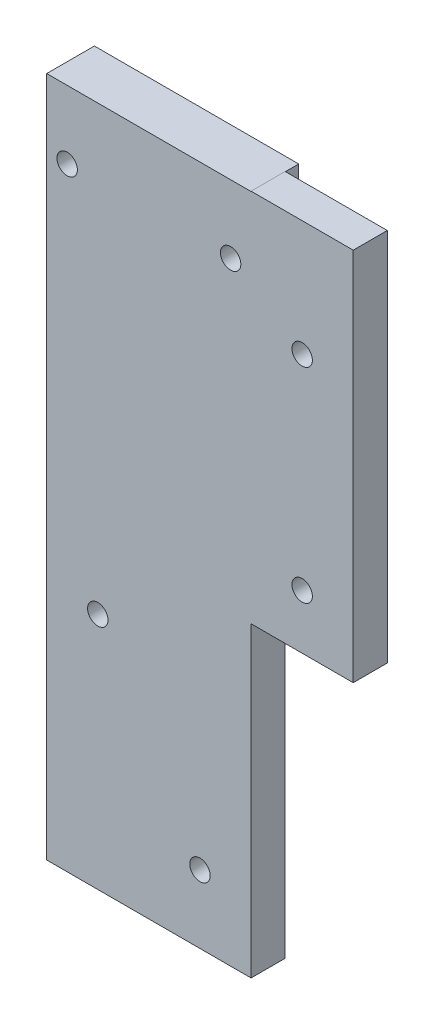
ISO-10303-21;
HEADER;
FILE_DESCRIPTION(('STEP AP214'),'2;1');
FILE_NAME('part.step','',(''),(''),'','','');
FILE_SCHEMA(('AUTOMOTIVE_DESIGN { 1 0 10303 214 1 1 1 1 }'));
ENDSEC;
DATA;
#1=APPLICATION_CONTEXT('core data for automotive mechanical design processes');
#2=APPLICATION_PROTOCOL_DEFINITION('international standard','automotive_design',2000,#1);
#3=PRODUCT_CONTEXT('',#1,'mechanical');
#4=PRODUCT('Part','Part','',(#3));
#5=PRODUCT_RELATED_PRODUCT_CATEGORY('part','',(#4));
#6=PRODUCT_DEFINITION_FORMATION('','',#4);
#7=PRODUCT_DEFINITION_CONTEXT('part definition',#1,'design');
#8=PRODUCT_DEFINITION('design','',#6,#7);
#9=PRODUCT_DEFINITION_SHAPE('','',#8);
#10=(LENGTH_UNIT() NAMED_UNIT(*) SI_UNIT(.MILLI.,.METRE.));
#11=(NAMED_UNIT(*) PLANE_ANGLE_UNIT() SI_UNIT($,.RADIAN.));
#12=(NAMED_UNIT(*) SI_UNIT($,.STERADIAN.) SOLID_ANGLE_UNIT());
#13=UNCERTAINTY_MEASURE_WITH_UNIT(LENGTH_MEASURE(1.E-05),#10,'distance_accuracy_value','');
#14=(GEOMETRIC_REPRESENTATION_CONTEXT(3) GLOBAL_UNCERTAINTY_ASSIGNED_CONTEXT((#13)) GLOBAL_UNIT_ASSIGNED_CONTEXT((#10,
#11,#12)) REPRESENTATION_CONTEXT('',''));
#15=CARTESIAN_POINT('',(0.,0.,0.));
#16=DIRECTION('',(0.,0.,1.));
#17=DIRECTION('',(1.,0.,0.));
#18=AXIS2_PLACEMENT_3D('',#15,#16,#17);
#19=CARTESIAN_POINT('',(95.4540410385415,-1005.00000000001,7.));
#20=DIRECTION('',(-1.,0.,0.));
#21=DIRECTION('',(0.,0.,1.));
#22=AXIS2_PLACEMENT_3D('',#19,#20,#21);
#23=PLANE('',#22);
#24=DIRECTION('',(0.,1.,0.));
#25=VECTOR('',#24,1.);
#26=CARTESIAN_POINT('',(95.4540410385415,-1004.95609231179,2.));
#27=LINE('',#26,#25);
#28=CARTESIAN_POINT('',(95.4540410385415,-1030.00000000001,2.));
#29=VERTEX_POINT('',#28);
#30=CARTESIAN_POINT('',(95.4540410385415,-1005.00000000001,2.));
#31=VERTEX_POINT('',#30);
#32=EDGE_CURVE('E11',#29,#31,#27,.T.);
#33=ORIENTED_EDGE('',*,*,#32,.F.);
#34=DIRECTION('',(0.,0.,1.));
#35=VECTOR('',#34,1.);
#36=CARTESIAN_POINT('',(95.4540410385415,-1030.00000000001,0.));
#37=LINE('',#36,#35);
#38=CARTESIAN_POINT('',(95.4540410385415,-1030.00000000001,0.));
#39=VERTEX_POINT('',#38);
#40=EDGE_CURVE('E193',#39,#29,#37,.T.);
#41=ORIENTED_EDGE('',*,*,#40,.F.);
#42=DIRECTION('',(0.,-1.,0.));
#43=VECTOR('',#42,1.);
#44=CARTESIAN_POINT('',(95.4540410385415,-1005.00000000001,0.));
#45=LINE('',#44,#43);
#46=CARTESIAN_POINT('',(95.4540410385415,-1005.00000000001,0.));
#47=VERTEX_POINT('',#46);
#48=EDGE_CURVE('E177',#47,#39,#45,.T.);
#49=ORIENTED_EDGE('',*,*,#48,.F.);
#50=DIRECTION('',(0.,0.,-1.));
#51=VECTOR('',#50,1.);
#52=CARTESIAN_POINT('',(95.4540410385415,-1005.00000000001,7.));
#53=LINE('',#52,#51);
#54=EDGE_CURVE('E65',#31,#47,#53,.T.);
#55=ORIENTED_EDGE('',*,*,#54,.F.);
#56=EDGE_LOOP('',(#33,#41,#49,#55));
#57=FACE_BOUND('',#56,.T.);
#58=ADVANCED_FACE('F39',(#57),#23,.F.);
#59=DIRECTION('',(0.,0.,-1.));
#60=VECTOR('',#59,1.);
#61=CARTESIAN_POINT('',(95.4540410385415,-1059.95609231179,7.));
#62=LINE('',#61,#60);
#63=CARTESIAN_POINT('',(95.4540410385415,-1059.95609231179,7.));
#64=VERTEX_POINT('',#63);
#65=CARTESIAN_POINT('',(95.4540410385415,-1059.95609231179,2.));
#66=VERTEX_POINT('',#65);
#67=EDGE_CURVE('E57',#64,#66,#62,.T.);
#68=ORIENTED_EDGE('',*,*,#67,.F.);
#69=DIRECTION('',(0.,1.,0.));
#70=VECTOR('',#69,1.);
#71=CARTESIAN_POINT('',(95.4540410385415,-1015.00000000001,7.));
#72=LINE('',#71,#70);
#73=CARTESIAN_POINT('',(95.4540410385415,-1105.00000000001,7.));
#74=VERTEX_POINT('',#73);
#75=EDGE_CURVE('E146',#74,#64,#72,.T.);
#76=ORIENTED_EDGE('',*,*,#75,.F.);
#77=DIRECTION('',(0.,0.,-1.));
#78=VECTOR('',#77,1.);
#79=CARTESIAN_POINT('',(95.4540410385415,-1105.00000000001,7.));
#80=LINE('',#79,#78);
#81=CARTESIAN_POINT('',(95.4540410385415,-1105.00000000001,2.));
#82=VERTEX_POINT('',#81);
#83=EDGE_CURVE('E215',#74,#82,#80,.T.);
#84=ORIENTED_EDGE('',*,*,#83,.T.);
#85=DIRECTION('',(0.,1.,0.));
#86=VECTOR('',#85,1.);
#87=CARTESIAN_POINT('',(95.4540410385415,-1005.00000000001,2.));
#88=LINE('',#87,#86);
#89=EDGE_CURVE('E209',#82,#66,#88,.T.);
#90=ORIENTED_EDGE('',*,*,#89,.T.);
#91=EDGE_LOOP('',(#68,#76,#84,#90));
#92=FACE_BOUND('',#91,.T.);
#93=ADVANCED_FACE('F271',(#92),#23,.F.);
#94=CARTESIAN_POINT('',(95.4540410385415,-1105.00000000001,7.));
#95=DIRECTION('',(0.,1.,0.));
#96=DIRECTION('',(0.,0.,1.));
#97=AXIS2_PLACEMENT_3D('',#94,#95,#96);
#98=PLANE('',#97);
#99=DIRECTION('',(1.,0.,0.));
#100=VECTOR('',#99,1.);
#101=CARTESIAN_POINT('',(95.4540410385415,-1105.00000000001,2.));
#102=LINE('',#101,#100);
#103=CARTESIAN_POINT('',(65.4540410385416,-1105.00000000001,2.));
#104=VERTEX_POINT('',#103);
#105=EDGE_CURVE('E196',#104,#82,#102,.T.);
#106=ORIENTED_EDGE('',*,*,#105,.T.);
#107=ORIENTED_EDGE('',*,*,#83,.F.);
#108=DIRECTION('',(1.,0.,0.));
#109=VECTOR('',#108,1.);
#110=CARTESIAN_POINT('',(95.4540410385415,-1105.00000000001,7.));
#111=LINE('',#110,#109);
#112=CARTESIAN_POINT('',(65.4540410385416,-1105.00000000001,7.));
#113=VERTEX_POINT('',#112);
#114=EDGE_CURVE('E199',#113,#74,#111,.T.);
#115=ORIENTED_EDGE('',*,*,#114,.F.);
#116=DIRECTION('',(0.,0.,-1.));
#117=VECTOR('',#116,1.);
#118=CARTESIAN_POINT('',(65.4540410385416,-1105.00000000001,7.));
#119=LINE('',#118,#117);
#120=EDGE_CURVE('E48',#113,#104,#119,.T.);
#121=ORIENTED_EDGE('',*,*,#120,.T.);
#122=EDGE_LOOP('',(#106,#107,#115,#121));
#123=FACE_BOUND('',#122,.T.);
#124=ADVANCED_FACE('F41',(#123),#98,.F.);
#125=CARTESIAN_POINT('',(65.4540410385416,-1005.00000000001,7.));
#126=DIRECTION('',(0.,-1.,0.));
#127=DIRECTION('',(0.,0.,-1.));
#128=AXIS2_PLACEMENT_3D('',#125,#126,#127);
#129=PLANE('',#128);
#130=CARTESIAN_POINT('',(95.4540410385415,-1005.00000000001,7.));
#131=VERTEX_POINT('',#130);
#132=EDGE_CURVE('E213',#131,#31,#53,.T.);
#133=ORIENTED_EDGE('',*,*,#132,.T.);
#134=ORIENTED_EDGE('',*,*,#54,.T.);
#135=DIRECTION('',(1.,0.,0.));
#136=VECTOR('',#135,1.);
#137=CARTESIAN_POINT('',(95.4540410385415,-1005.00000000001,0.));
#138=LINE('',#137,#136);
#139=CARTESIAN_POINT('',(65.4540410385416,-1005.00000000001,0.));
#140=VERTEX_POINT('',#139);
#141=EDGE_CURVE('E185',#140,#47,#138,.T.);
#142=ORIENTED_EDGE('',*,*,#141,.F.);
#143=DIRECTION('',(0.,0.,-1.));
#144=VECTOR('',#143,1.);
#145=CARTESIAN_POINT('',(65.4540410385416,-1005.00000000001,7.));
#146=LINE('',#145,#144);
#147=CARTESIAN_POINT('',(65.4540410385416,-1005.00000000001,7.));
#148=VERTEX_POINT('',#147);
#149=EDGE_CURVE('E206',#148,#140,#146,.T.);
#150=ORIENTED_EDGE('',*,*,#149,.F.);
#151=DIRECTION('',(-1.,0.,0.));
#152=VECTOR('',#151,1.);
#153=CARTESIAN_POINT('',(65.4540410385416,-1005.00000000001,7.));
#154=LINE('',#153,#152);
#155=EDGE_CURVE('E203',#131,#148,#154,.T.);
#156=ORIENTED_EDGE('',*,*,#155,.F.);
#157=EDGE_LOOP('',(#133,#134,#142,#150,#156));
#158=FACE_BOUND('',#157,.T.);
#159=ADVANCED_FACE('F256',(#158),#129,.F.);
#160=CARTESIAN_POINT('',(65.4540410385416,-1015.00000000001,7.));
#161=DIRECTION('',(1.,0.,0.));
#162=DIRECTION('',(0.,0.,-1.));
#163=AXIS2_PLACEMENT_3D('',#160,#161,#162);
#164=PLANE('',#163);
#165=ORIENTED_EDGE('',*,*,#149,.T.);
#166=DIRECTION('',(0.,1.,0.));
#167=VECTOR('',#166,1.);
#168=CARTESIAN_POINT('',(65.4540410385416,-1030.00000000001,0.));
#169=LINE('',#168,#167);
#170=CARTESIAN_POINT('',(65.4540410385416,-1030.00000000001,0.));
#171=VERTEX_POINT('',#170);
#172=EDGE_CURVE('E182',#171,#140,#169,.T.);
#173=ORIENTED_EDGE('',*,*,#172,.F.);
#174=DIRECTION('',(0.,0.,1.));
#175=VECTOR('',#174,1.);
#176=CARTESIAN_POINT('',(65.4540410385416,-1030.00000000001,0.));
#177=LINE('',#176,#175);
#178=CARTESIAN_POINT('',(65.4540410385416,-1030.00000000001,2.));
#179=VERTEX_POINT('',#178);
#180=EDGE_CURVE('E188',#171,#179,#177,.T.);
#181=ORIENTED_EDGE('',*,*,#180,.T.);
#182=DIRECTION('',(0.,-1.,0.));
#183=VECTOR('',#182,1.);
#184=CARTESIAN_POINT('',(65.4540410385416,-1015.00000000001,2.));
#185=LINE('',#184,#183);
#186=EDGE_CURVE('E200',#179,#104,#185,.T.);
#187=ORIENTED_EDGE('',*,*,#186,.T.);
#188=ORIENTED_EDGE('',*,*,#120,.F.);
#189=DIRECTION('',(0.,-1.,0.));
#190=VECTOR('',#189,1.);
#191=CARTESIAN_POINT('',(65.4540410385416,-1105.00000000001,7.));
#192=LINE('',#191,#190);
#193=EDGE_CURVE('E197',#148,#113,#192,.T.);
#194=ORIENTED_EDGE('',*,*,#193,.F.);
#195=EDGE_LOOP('',(#165,#173,#181,#187,#188,#194));
#196=FACE_BOUND('',#195,.T.);
#197=ADVANCED_FACE('F259',(#196),#164,.F.);
#198=CARTESIAN_POINT('',(0.,0.,7.));
#199=DIRECTION('',(0.,0.,-1.));
#200=DIRECTION('',(-1.,0.,0.));
#201=AXIS2_PLACEMENT_3D('',#198,#199,#200);
#202=PLANE('',#201);
#203=CARTESIAN_POINT('',(102.954041038542,-1051.95609231179,7.));
#204=DIRECTION('',(0.,0.,1.));
#205=DIRECTION('',(1.,0.,0.));
#206=AXIS2_PLACEMENT_3D('',#203,#204,#205);
#207=CIRCLE('',#206,1.49999999999993);
#208=CARTESIAN_POINT('',(104.454041038541,-1051.95609231179,7.));
#209=VERTEX_POINT('',#208);
#210=EDGE_CURVE('E221',#209,#209,#207,.T.);
#211=ORIENTED_EDGE('',*,*,#210,.F.);
#212=EDGE_LOOP('',(#211));
#213=FACE_BOUND('',#212,.T.);
#214=CARTESIAN_POINT('',(102.954041038542,-1021.95609231179,7.));
#215=DIRECTION('',(0.,0.,1.));
#216=DIRECTION('',(1.,0.,0.));
#217=AXIS2_PLACEMENT_3D('',#214,#215,#216);
#218=CIRCLE('',#217,1.49999999999996);
#219=CARTESIAN_POINT('',(104.454041038541,-1021.95609231179,7.));
#220=VERTEX_POINT('',#219);
#221=EDGE_CURVE('E227',#220,#220,#218,.T.);
#222=ORIENTED_EDGE('',*,*,#221,.F.);
#223=EDGE_LOOP('',(#222));
#224=FACE_BOUND('',#223,.T.);
#225=CARTESIAN_POINT('',(92.4540410384546,-1014.99996309585,7.));
#226=DIRECTION('',(0.,0.,-1.));
#227=DIRECTION('',(-1.,0.,0.));
#228=AXIS2_PLACEMENT_3D('',#225,#226,#227);
#229=CIRCLE('',#228,1.50003690415539);
#230=CARTESIAN_POINT('',(90.9540041342992,-1014.99996309585,7.));
#231=VERTEX_POINT('',#230);
#232=EDGE_CURVE('E161',#231,#231,#229,.T.);
#233=ORIENTED_EDGE('',*,*,#232,.T.);
#234=EDGE_LOOP('',(#233));
#235=FACE_BOUND('',#234,.T.);
#236=CARTESIAN_POINT('',(68.454041038545,-1015.00000000001,7.));
#237=DIRECTION('',(0.,0.,-1.));
#238=DIRECTION('',(-1.,0.,0.));
#239=AXIS2_PLACEMENT_3D('',#236,#237,#238);
#240=CIRCLE('',#239,1.50000000000008);
#241=CARTESIAN_POINT('',(66.954041038545,-1015.00000000001,7.));
#242=VERTEX_POINT('',#241);
#243=EDGE_CURVE('E157',#242,#242,#240,.T.);
#244=ORIENTED_EDGE('',*,*,#243,.T.);
#245=EDGE_LOOP('',(#244));
#246=FACE_BOUND('',#245,.T.);
#247=CARTESIAN_POINT('',(72.9540410385427,-1070.00000000001,7.));
#248=DIRECTION('',(0.,0.,-1.));
#249=DIRECTION('',(-1.,0.,0.));
#250=AXIS2_PLACEMENT_3D('',#247,#248,#249);
#251=CIRCLE('',#250,1.50000000000008);
#252=CARTESIAN_POINT('',(71.4540410385426,-1070.00000000001,7.));
#253=VERTEX_POINT('',#252);
#254=EDGE_CURVE('E173',#253,#253,#251,.T.);
#255=ORIENTED_EDGE('',*,*,#254,.T.);
#256=EDGE_LOOP('',(#255));
#257=FACE_BOUND('',#256,.T.);
#258=CARTESIAN_POINT('',(87.9540410385427,-1095.00000000001,7.));
#259=DIRECTION('',(0.,0.,-1.));
#260=DIRECTION('',(-1.,0.,0.));
#261=AXIS2_PLACEMENT_3D('',#258,#259,#260);
#262=CIRCLE('',#261,1.50000000000007);
#263=CARTESIAN_POINT('',(86.4540410385426,-1095.00000000001,7.));
#264=VERTEX_POINT('',#263);
#265=EDGE_CURVE('E168',#264,#264,#262,.T.);
#266=ORIENTED_EDGE('',*,*,#265,.T.);
#267=EDGE_LOOP('',(#266));
#268=FACE_BOUND('',#267,.T.);
#269=ORIENTED_EDGE('',*,*,#193,.T.);
#270=ORIENTED_EDGE('',*,*,#114,.T.);
#271=ORIENTED_EDGE('',*,*,#75,.T.);
#272=DIRECTION('',(-1.,0.,0.));
#273=VECTOR('',#272,1.);
#274=CARTESIAN_POINT('',(110.454041038542,-1059.95609231179,7.));
#275=LINE('',#274,#273);
#276=CARTESIAN_POINT('',(110.454041038542,-1059.95609231179,7.));
#277=VERTEX_POINT('',#276);
#278=EDGE_CURVE('E127',#277,#64,#275,.T.);
#279=ORIENTED_EDGE('',*,*,#278,.F.);
#280=DIRECTION('',(0.,-1.,0.));
#281=VECTOR('',#280,1.);
#282=CARTESIAN_POINT('',(110.454041038542,-1004.95609231179,7.00000000000001));
#283=LINE('',#282,#281);
#284=CARTESIAN_POINT('',(110.454041038542,-1004.95609231179,7.00000000000001));
#285=VERTEX_POINT('',#284);
#286=EDGE_CURVE('E133',#285,#277,#283,.T.);
#287=ORIENTED_EDGE('',*,*,#286,.F.);
#288=DIRECTION('',(-1.,0.,0.));
#289=VECTOR('',#288,1.);
#290=CARTESIAN_POINT('',(110.454041038542,-1004.95609231179,7.00000000000001));
#291=LINE('',#290,#289);
#292=CARTESIAN_POINT('',(95.4540410385415,-1004.95609231179,7.00000000000001));
#293=VERTEX_POINT('',#292);
#294=EDGE_CURVE('E236',#285,#293,#291,.T.);
#295=ORIENTED_EDGE('',*,*,#294,.T.);
#296=DIRECTION('',(0.,-1.,0.));
#297=VECTOR('',#296,1.);
#298=CARTESIAN_POINT('',(95.4540410385415,-1004.95609231179,7.00000000000001));
#299=LINE('',#298,#297);
#300=EDGE_CURVE('E225',#293,#131,#299,.T.);
#301=ORIENTED_EDGE('',*,*,#300,.T.);
#302=ORIENTED_EDGE('',*,*,#155,.T.);
#303=EDGE_LOOP('',(#269,#270,#271,#279,#287,#295,#301,#302));
#304=FACE_BOUND('',#303,.T.);
#305=ADVANCED_FACE('F145',(#213,#224,#235,#246,#257,#268,#304),#202,.F.);
#306=CARTESIAN_POINT('',(0.,0.,2.));
#307=DIRECTION('',(0.,0.,-1.));
#308=DIRECTION('',(-1.,0.,0.));
#309=AXIS2_PLACEMENT_3D('',#306,#307,#308);
#310=PLANE('',#309);
#311=CARTESIAN_POINT('',(102.954041038542,-1051.95609231179,2.));
#312=DIRECTION('',(0.,0.,-1.));
#313=DIRECTION('',(-1.,0.,0.));
#314=AXIS2_PLACEMENT_3D('',#311,#312,#313);
#315=CIRCLE('',#314,1.49999999999993);
#316=CARTESIAN_POINT('',(101.454041038542,-1051.95609231179,2.));
#317=VERTEX_POINT('',#316);
#318=EDGE_CURVE('E43',#317,#317,#315,.T.);
#319=ORIENTED_EDGE('',*,*,#318,.F.);
#320=EDGE_LOOP('',(#319));
#321=FACE_BOUND('',#320,.T.);
#322=CARTESIAN_POINT('',(102.954041038542,-1021.95609231179,2.));
#323=DIRECTION('',(0.,0.,-1.));
#324=DIRECTION('',(-1.,0.,0.));
#325=AXIS2_PLACEMENT_3D('',#322,#323,#324);
#326=CIRCLE('',#325,1.49999999999996);
#327=CARTESIAN_POINT('',(101.454041038542,-1021.95609231179,2.));
#328=VERTEX_POINT('',#327);
#329=EDGE_CURVE('E219',#328,#328,#326,.T.);
#330=ORIENTED_EDGE('',*,*,#329,.F.);
#331=EDGE_LOOP('',(#330));
#332=FACE_BOUND('',#331,.T.);
#333=CARTESIAN_POINT('',(72.9540410385427,-1070.00000000001,2.));
#334=DIRECTION('',(0.,0.,-1.));
#335=DIRECTION('',(-1.,0.,0.));
#336=AXIS2_PLACEMENT_3D('',#333,#334,#335);
#337=CIRCLE('',#336,1.50000000000008);
#338=CARTESIAN_POINT('',(71.4540410385426,-1070.00000000001,2.));
#339=VERTEX_POINT('',#338);
#340=EDGE_CURVE('E165',#339,#339,#337,.T.);
#341=ORIENTED_EDGE('',*,*,#340,.F.);
#342=EDGE_LOOP('',(#341));
#343=FACE_BOUND('',#342,.T.);
#344=CARTESIAN_POINT('',(87.9540410385427,-1095.00000000001,2.));
#345=DIRECTION('',(0.,0.,-1.));
#346=DIRECTION('',(-1.,0.,0.));
#347=AXIS2_PLACEMENT_3D('',#344,#345,#346);
#348=CIRCLE('',#347,1.50000000000007);
#349=CARTESIAN_POINT('',(86.4540410385426,-1095.00000000001,2.));
#350=VERTEX_POINT('',#349);
#351=EDGE_CURVE('E164',#350,#350,#348,.T.);
#352=ORIENTED_EDGE('',*,*,#351,.F.);
#353=EDGE_LOOP('',(#352));
#354=FACE_BOUND('',#353,.T.);
#355=DIRECTION('',(-1.,0.,0.));
#356=VECTOR('',#355,1.);
#357=CARTESIAN_POINT('',(95.4540410385415,-1030.00000000001,2.));
#358=LINE('',#357,#356);
#359=EDGE_CURVE('E176',#29,#179,#358,.T.);
#360=ORIENTED_EDGE('',*,*,#359,.F.);
#361=ORIENTED_EDGE('',*,*,#32,.T.);
#362=CARTESIAN_POINT('',(95.4540410385415,-1004.95609231179,2.));
#363=VERTEX_POINT('',#362);
#364=EDGE_CURVE('E50',#31,#363,#27,.T.);
#365=ORIENTED_EDGE('',*,*,#364,.T.);
#366=DIRECTION('',(-1.,0.,0.));
#367=VECTOR('',#366,1.);
#368=CARTESIAN_POINT('',(110.454041038542,-1004.95609231179,2.));
#369=LINE('',#368,#367);
#370=CARTESIAN_POINT('',(110.454041038542,-1004.95609231179,2.));
#371=VERTEX_POINT('',#370);
#372=EDGE_CURVE('E152',#371,#363,#369,.T.);
#373=ORIENTED_EDGE('',*,*,#372,.F.);
#374=DIRECTION('',(0.,1.,0.));
#375=VECTOR('',#374,1.);
#376=CARTESIAN_POINT('',(110.454041038542,-1004.95609231179,2.));
#377=LINE('',#376,#375);
#378=CARTESIAN_POINT('',(110.454041038542,-1059.95609231179,2.));
#379=VERTEX_POINT('',#378);
#380=EDGE_CURVE('E132',#379,#371,#377,.T.);
#381=ORIENTED_EDGE('',*,*,#380,.F.);
#382=DIRECTION('',(-1.,0.,0.));
#383=VECTOR('',#382,1.);
#384=CARTESIAN_POINT('',(110.454041038542,-1059.95609231179,2.));
#385=LINE('',#384,#383);
#386=EDGE_CURVE('E129',#379,#66,#385,.T.);
#387=ORIENTED_EDGE('',*,*,#386,.T.);
#388=ORIENTED_EDGE('',*,*,#89,.F.);
#389=ORIENTED_EDGE('',*,*,#105,.F.);
#390=ORIENTED_EDGE('',*,*,#186,.F.);
#391=EDGE_LOOP('',(#360,#361,#365,#373,#381,#387,#388,#389,#390));
#392=FACE_BOUND('',#391,.T.);
#393=ADVANCED_FACE('F268',(#321,#332,#343,#354,#392),#310,.T.);
#394=CARTESIAN_POINT('',(95.4540410385415,-1030.00000000001,0.));
#395=DIRECTION('',(0.,1.,0.));
#396=DIRECTION('',(0.,0.,1.));
#397=AXIS2_PLACEMENT_3D('',#394,#395,#396);
#398=PLANE('',#397);
#399=ORIENTED_EDGE('',*,*,#359,.T.);
#400=ORIENTED_EDGE('',*,*,#180,.F.);
#401=DIRECTION('',(-1.,0.,0.));
#402=VECTOR('',#401,1.);
#403=CARTESIAN_POINT('',(95.4540410385415,-1030.00000000001,0.));
#404=LINE('',#403,#402);
#405=EDGE_CURVE('E180',#39,#171,#404,.T.);
#406=ORIENTED_EDGE('',*,*,#405,.F.);
#407=ORIENTED_EDGE('',*,*,#40,.T.);
#408=EDGE_LOOP('',(#399,#400,#406,#407));
#409=FACE_BOUND('',#408,.T.);
#410=ADVANCED_FACE('F265',(#409),#398,.F.);
#411=CARTESIAN_POINT('',(0.,0.,0.));
#412=DIRECTION('',(0.,0.,-1.));
#413=DIRECTION('',(-1.,0.,0.));
#414=AXIS2_PLACEMENT_3D('',#411,#412,#413);
#415=PLANE('',#414);
#416=CARTESIAN_POINT('',(92.4540410384546,-1014.99996309585,0.));
#417=DIRECTION('',(0.,0.,-1.));
#418=DIRECTION('',(-1.,0.,0.));
#419=AXIS2_PLACEMENT_3D('',#416,#417,#418);
#420=CIRCLE('',#419,1.50003690415539);
#421=CARTESIAN_POINT('',(90.9540041342992,-1014.99996309585,0.));
#422=VERTEX_POINT('',#421);
#423=EDGE_CURVE('E150',#422,#422,#420,.T.);
#424=ORIENTED_EDGE('',*,*,#423,.F.);
#425=EDGE_LOOP('',(#424));
#426=FACE_BOUND('',#425,.T.);
#427=CARTESIAN_POINT('',(68.454041038545,-1015.00000000001,0.));
#428=DIRECTION('',(0.,0.,-1.));
#429=DIRECTION('',(-1.,0.,0.));
#430=AXIS2_PLACEMENT_3D('',#427,#428,#429);
#431=CIRCLE('',#430,1.50000000000008);
#432=CARTESIAN_POINT('',(66.954041038545,-1015.00000000001,0.));
#433=VERTEX_POINT('',#432);
#434=EDGE_CURVE('E147',#433,#433,#431,.T.);
#435=ORIENTED_EDGE('',*,*,#434,.F.);
#436=EDGE_LOOP('',(#435));
#437=FACE_BOUND('',#436,.T.);
#438=ORIENTED_EDGE('',*,*,#48,.T.);
#439=ORIENTED_EDGE('',*,*,#405,.T.);
#440=ORIENTED_EDGE('',*,*,#172,.T.);
#441=ORIENTED_EDGE('',*,*,#141,.T.);
#442=EDGE_LOOP('',(#438,#439,#440,#441));
#443=FACE_BOUND('',#442,.T.);
#444=ADVANCED_FACE('F261',(#426,#437,#443),#415,.T.);
#445=CARTESIAN_POINT('',(87.9540410385427,-1095.00000000001,12.));
#446=DIRECTION('',(0.,0.,-1.));
#447=DIRECTION('',(-1.,0.,0.));
#448=AXIS2_PLACEMENT_3D('',#445,#446,#447);
#449=CYLINDRICAL_SURFACE('',#448,1.50000000000007);
#450=ORIENTED_EDGE('',*,*,#351,.T.);
#451=EDGE_LOOP('',(#450));
#452=FACE_BOUND('',#451,.T.);
#453=ORIENTED_EDGE('',*,*,#265,.F.);
#454=EDGE_LOOP('',(#453));
#455=FACE_BOUND('',#454,.T.);
#456=ADVANCED_FACE('F292',(#452,#455),#449,.F.);
#457=CARTESIAN_POINT('',(72.9540410385427,-1070.00000000001,12.));
#458=DIRECTION('',(0.,0.,-1.));
#459=DIRECTION('',(-1.,0.,0.));
#460=AXIS2_PLACEMENT_3D('',#457,#458,#459);
#461=CYLINDRICAL_SURFACE('',#460,1.50000000000008);
#462=ORIENTED_EDGE('',*,*,#340,.T.);
#463=EDGE_LOOP('',(#462));
#464=FACE_BOUND('',#463,.T.);
#465=ORIENTED_EDGE('',*,*,#254,.F.);
#466=EDGE_LOOP('',(#465));
#467=FACE_BOUND('',#466,.T.);
#468=ADVANCED_FACE('F296',(#464,#467),#461,.F.);
#469=CARTESIAN_POINT('',(68.454041038545,-1015.00000000001,10.));
#470=DIRECTION('',(0.,0.,-1.));
#471=DIRECTION('',(-1.,0.,0.));
#472=AXIS2_PLACEMENT_3D('',#469,#470,#471);
#473=CYLINDRICAL_SURFACE('',#472,1.50000000000008);
#474=ORIENTED_EDGE('',*,*,#434,.T.);
#475=EDGE_LOOP('',(#474));
#476=FACE_BOUND('',#475,.T.);
#477=ORIENTED_EDGE('',*,*,#243,.F.);
#478=EDGE_LOOP('',(#477));
#479=FACE_BOUND('',#478,.T.);
#480=ADVANCED_FACE('F300',(#476,#479),#473,.F.);
#481=CARTESIAN_POINT('',(92.4540410384546,-1014.99996309585,10.));
#482=DIRECTION('',(0.,0.,-1.));
#483=DIRECTION('',(-1.,0.,0.));
#484=AXIS2_PLACEMENT_3D('',#481,#482,#483);
#485=CYLINDRICAL_SURFACE('',#484,1.50003690415539);
#486=ORIENTED_EDGE('',*,*,#423,.T.);
#487=EDGE_LOOP('',(#486));
#488=FACE_BOUND('',#487,.T.);
#489=ORIENTED_EDGE('',*,*,#232,.F.);
#490=EDGE_LOOP('',(#489));
#491=FACE_BOUND('',#490,.T.);
#492=ADVANCED_FACE('F304',(#488,#491),#485,.F.);
#493=CARTESIAN_POINT('',(110.454041038542,-1059.95609231179,7.));
#494=DIRECTION('',(0.,1.,0.));
#495=DIRECTION('',(0.,0.,1.));
#496=AXIS2_PLACEMENT_3D('',#493,#494,#495);
#497=PLANE('',#496);
#498=ORIENTED_EDGE('',*,*,#67,.T.);
#499=ORIENTED_EDGE('',*,*,#386,.F.);
#500=DIRECTION('',(0.,0.,-1.));
#501=VECTOR('',#500,1.);
#502=CARTESIAN_POINT('',(110.454041038542,-1059.95609231179,7.));
#503=LINE('',#502,#501);
#504=EDGE_CURVE('E123',#277,#379,#503,.T.);
#505=ORIENTED_EDGE('',*,*,#504,.F.);
#506=ORIENTED_EDGE('',*,*,#278,.T.);
#507=EDGE_LOOP('',(#498,#499,#505,#506));
#508=FACE_BOUND('',#507,.T.);
#509=ADVANCED_FACE('F125',(#508),#497,.F.);
#510=CARTESIAN_POINT('',(110.454041038542,-1004.95609231179,7.00000000000001));
#511=DIRECTION('',(0.,-1.,0.));
#512=DIRECTION('',(0.,0.,-1.));
#513=AXIS2_PLACEMENT_3D('',#510,#511,#512);
#514=PLANE('',#513);
#515=DIRECTION('',(0.,0.,1.));
#516=VECTOR('',#515,1.);
#517=CARTESIAN_POINT('',(95.4540410385415,-1004.95609231179,7.00000000000001));
#518=LINE('',#517,#516);
#519=EDGE_CURVE('E142',#363,#293,#518,.T.);
#520=ORIENTED_EDGE('',*,*,#519,.T.);
#521=ORIENTED_EDGE('',*,*,#294,.F.);
#522=DIRECTION('',(0.,0.,1.));
#523=VECTOR('',#522,1.);
#524=CARTESIAN_POINT('',(110.454041038542,-1004.95609231179,7.00000000000001));
#525=LINE('',#524,#523);
#526=EDGE_CURVE('E138',#371,#285,#525,.T.);
#527=ORIENTED_EDGE('',*,*,#526,.F.);
#528=ORIENTED_EDGE('',*,*,#372,.T.);
#529=EDGE_LOOP('',(#520,#521,#527,#528));
#530=FACE_BOUND('',#529,.T.);
#531=ADVANCED_FACE('F245',(#530),#514,.F.);
#532=CARTESIAN_POINT('',(110.454041038542,0.,0.));
#533=DIRECTION('',(1.,0.,0.));
#534=DIRECTION('',(0.,0.,-1.));
#535=AXIS2_PLACEMENT_3D('',#532,#533,#534);
#536=PLANE('',#535);
#537=ORIENTED_EDGE('',*,*,#286,.T.);
#538=ORIENTED_EDGE('',*,*,#504,.T.);
#539=ORIENTED_EDGE('',*,*,#380,.T.);
#540=ORIENTED_EDGE('',*,*,#526,.T.);
#541=EDGE_LOOP('',(#537,#538,#539,#540));
#542=FACE_BOUND('',#541,.T.);
#543=ADVANCED_FACE('F136',(#542),#536,.T.);
#544=CARTESIAN_POINT('',(95.4540410385415,0.,0.));
#545=DIRECTION('',(1.,0.,0.));
#546=DIRECTION('',(0.,0.,-1.));
#547=AXIS2_PLACEMENT_3D('',#544,#545,#546);
#548=PLANE('',#547);
#549=ORIENTED_EDGE('',*,*,#132,.F.);
#550=ORIENTED_EDGE('',*,*,#300,.F.);
#551=ORIENTED_EDGE('',*,*,#519,.F.);
#552=ORIENTED_EDGE('',*,*,#364,.F.);
#553=EDGE_LOOP('',(#549,#550,#551,#552));
#554=FACE_BOUND('',#553,.T.);
#555=ADVANCED_FACE('F251',(#554),#548,.F.);
#556=CARTESIAN_POINT('',(102.954041038542,-1021.95609231179,-13.));
#557=DIRECTION('',(0.,0.,1.));
#558=DIRECTION('',(1.,0.,0.));
#559=AXIS2_PLACEMENT_3D('',#556,#557,#558);
#560=CYLINDRICAL_SURFACE('',#559,1.49999999999996);
#561=ORIENTED_EDGE('',*,*,#329,.T.);
#562=EDGE_LOOP('',(#561));
#563=FACE_BOUND('',#562,.T.);
#564=ORIENTED_EDGE('',*,*,#221,.T.);
#565=EDGE_LOOP('',(#564));
#566=FACE_BOUND('',#565,.T.);
#567=ADVANCED_FACE('F315',(#563,#566),#560,.F.);
#568=CARTESIAN_POINT('',(102.954041038542,-1051.95609231179,-13.));
#569=DIRECTION('',(0.,0.,1.));
#570=DIRECTION('',(1.,0.,0.));
#571=AXIS2_PLACEMENT_3D('',#568,#569,#570);
#572=CYLINDRICAL_SURFACE('',#571,1.49999999999993);
#573=ORIENTED_EDGE('',*,*,#318,.T.);
#574=EDGE_LOOP('',(#573));
#575=FACE_BOUND('',#574,.T.);
#576=ORIENTED_EDGE('',*,*,#210,.T.);
#577=EDGE_LOOP('',(#576));
#578=FACE_BOUND('',#577,.T.);
#579=ADVANCED_FACE('F320',(#575,#578),#572,.F.);
#580=CLOSED_SHELL('',(#58,#93,#124,#159,#197,#305,#393,#410,#444,#456,#468,#480,#492,#509,#531,
#543,#555,#567,#579));
#581=MANIFOLD_SOLID_BREP('B2',#580);
#582=ADVANCED_BREP_SHAPE_REPRESENTATION('',(#18,#581),#14);
#583=SHAPE_DEFINITION_REPRESENTATION(#9,#582);
ENDSEC;
END-ISO-10303-21;
